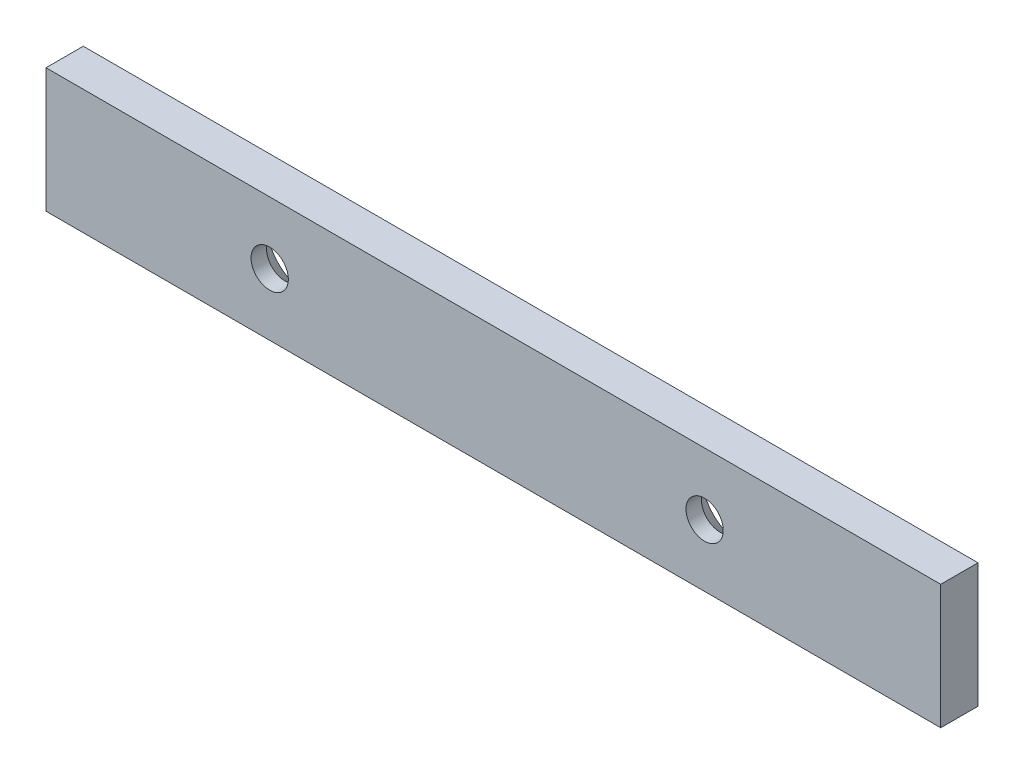
ISO-10303-21;
HEADER;
FILE_DESCRIPTION(('STEP AP214'),'2;1');
FILE_NAME('part.step','',(''),(''),'','','');
FILE_SCHEMA(('AUTOMOTIVE_DESIGN { 1 0 10303 214 1 1 1 1 }'));
ENDSEC;
DATA;
#1=APPLICATION_CONTEXT('core data for automotive mechanical design processes');
#2=APPLICATION_PROTOCOL_DEFINITION('international standard','automotive_design',2000,#1);
#3=PRODUCT_CONTEXT('',#1,'mechanical');
#4=PRODUCT('Part','Part','',(#3));
#5=PRODUCT_RELATED_PRODUCT_CATEGORY('part','',(#4));
#6=PRODUCT_DEFINITION_FORMATION('','',#4);
#7=PRODUCT_DEFINITION_CONTEXT('part definition',#1,'design');
#8=PRODUCT_DEFINITION('design','',#6,#7);
#9=PRODUCT_DEFINITION_SHAPE('','',#8);
#10=(LENGTH_UNIT() NAMED_UNIT(*) SI_UNIT(.MILLI.,.METRE.));
#11=(NAMED_UNIT(*) PLANE_ANGLE_UNIT() SI_UNIT($,.RADIAN.));
#12=(NAMED_UNIT(*) SI_UNIT($,.STERADIAN.) SOLID_ANGLE_UNIT());
#13=UNCERTAINTY_MEASURE_WITH_UNIT(LENGTH_MEASURE(1.E-05),#10,'distance_accuracy_value','');
#14=(GEOMETRIC_REPRESENTATION_CONTEXT(3) GLOBAL_UNCERTAINTY_ASSIGNED_CONTEXT((#13)) GLOBAL_UNIT_ASSIGNED_CONTEXT((#10,
#11,#12)) REPRESENTATION_CONTEXT('',''));
#15=CARTESIAN_POINT('',(0.,0.,0.));
#16=DIRECTION('',(0.,0.,1.));
#17=DIRECTION('',(1.,0.,0.));
#18=AXIS2_PLACEMENT_3D('',#15,#16,#17);
#19=CARTESIAN_POINT('',(-55.6641781740509,14.3159818061718,6.00000000000001));
#20=DIRECTION('',(1.,0.,0.));
#21=DIRECTION('',(0.,0.,-0.999999999999992));
#22=AXIS2_PLACEMENT_3D('',#19,#20,#21);
#23=PLANE('',#22);
#24=DIRECTION('',(0.,-1.,0.));
#25=VECTOR('',#24,1.);
#26=CARTESIAN_POINT('',(-55.6641781740509,14.3159818061718,0.));
#27=LINE('',#26,#25);
#28=CARTESIAN_POINT('',(-55.6641781740509,14.3159818061718,0.));
#29=VERTEX_POINT('',#28);
#30=CARTESIAN_POINT('',(-55.6641781740509,-5.68401819382819,0.));
#31=VERTEX_POINT('',#30);
#32=EDGE_CURVE('E105',#29,#31,#27,.T.);
#33=ORIENTED_EDGE('',*,*,#32,.T.);
#34=DIRECTION('',(0.,0.,-0.999999999999992));
#35=VECTOR('',#34,1.);
#36=CARTESIAN_POINT('',(-55.6641781740509,-5.68401819382819,6.00000000000001));
#37=LINE('',#36,#35);
#38=CARTESIAN_POINT('',(-55.6641781740509,-5.68401819382819,6.00000000000001));
#39=VERTEX_POINT('',#38);
#40=EDGE_CURVE('E11',#39,#31,#37,.T.);
#41=ORIENTED_EDGE('',*,*,#40,.F.);
#42=DIRECTION('',(0.,-1.,0.));
#43=VECTOR('',#42,1.);
#44=CARTESIAN_POINT('',(-55.6641781740509,14.3159818061718,6.00000000000001));
#45=LINE('',#44,#43);
#46=CARTESIAN_POINT('',(-55.6641781740509,14.3159818061718,6.00000000000001));
#47=VERTEX_POINT('',#46);
#48=EDGE_CURVE('E92',#47,#39,#45,.T.);
#49=ORIENTED_EDGE('',*,*,#48,.F.);
#50=DIRECTION('',(0.,0.,-0.999999999999992));
#51=VECTOR('',#50,1.);
#52=CARTESIAN_POINT('',(-55.6641781740509,14.3159818061718,6.00000000000001));
#53=LINE('',#52,#51);
#54=EDGE_CURVE('E101',#47,#29,#53,.T.);
#55=ORIENTED_EDGE('',*,*,#54,.T.);
#56=EDGE_LOOP('',(#33,#41,#49,#55));
#57=FACE_BOUND('',#56,.T.);
#58=ADVANCED_FACE('F39',(#57),#23,.F.);
#59=CARTESIAN_POINT('',(-55.6641781740509,-5.68401819382819,6.00000000000001));
#60=DIRECTION('',(0.,1.,0.));
#61=DIRECTION('',(0.,0.,0.999999999999992));
#62=AXIS2_PLACEMENT_3D('',#59,#60,#61);
#63=PLANE('',#62);
#64=DIRECTION('',(1.,0.,0.));
#65=VECTOR('',#64,1.);
#66=CARTESIAN_POINT('',(-55.6641781740509,-5.68401819382819,0.));
#67=LINE('',#66,#65);
#68=CARTESIAN_POINT('',(88.3358218259482,-5.68401819382916,0.));
#69=VERTEX_POINT('',#68);
#70=EDGE_CURVE('E96',#31,#69,#67,.T.);
#71=ORIENTED_EDGE('',*,*,#70,.T.);
#72=DIRECTION('',(0.,0.,-0.999999999999992));
#73=VECTOR('',#72,1.);
#74=CARTESIAN_POINT('',(88.3358218259482,-5.68401819382916,6.00000000000001));
#75=LINE('',#74,#73);
#76=CARTESIAN_POINT('',(88.3358218259482,-5.68401819382916,6.00000000000001));
#77=VERTEX_POINT('',#76);
#78=EDGE_CURVE('E48',#77,#69,#75,.T.);
#79=ORIENTED_EDGE('',*,*,#78,.F.);
#80=DIRECTION('',(1.,0.,0.));
#81=VECTOR('',#80,1.);
#82=CARTESIAN_POINT('',(-55.6641781740509,-5.68401819382819,6.00000000000001));
#83=LINE('',#82,#81);
#84=EDGE_CURVE('E87',#39,#77,#83,.T.);
#85=ORIENTED_EDGE('',*,*,#84,.F.);
#86=ORIENTED_EDGE('',*,*,#40,.T.);
#87=EDGE_LOOP('',(#71,#79,#85,#86));
#88=FACE_BOUND('',#87,.T.);
#89=ADVANCED_FACE('F95',(#88),#63,.F.);
#90=CARTESIAN_POINT('',(88.3358218259491,14.3159818061709,6.00000000000001));
#91=DIRECTION('',(-1.,0.,0.));
#92=DIRECTION('',(0.,0.,0.999999999999992));
#93=AXIS2_PLACEMENT_3D('',#90,#91,#92);
#94=PLANE('',#93);
#95=DIRECTION('',(0.,1.,0.));
#96=VECTOR('',#95,1.);
#97=CARTESIAN_POINT('',(88.3358218259491,14.3159818061709,0.));
#98=LINE('',#97,#96);
#99=CARTESIAN_POINT('',(88.3358218259491,14.3159818061709,0.));
#100=VERTEX_POINT('',#99);
#101=EDGE_CURVE('E74',#69,#100,#98,.T.);
#102=ORIENTED_EDGE('',*,*,#101,.T.);
#103=DIRECTION('',(0.,0.,-0.999999999999992));
#104=VECTOR('',#103,1.);
#105=CARTESIAN_POINT('',(88.3358218259491,14.3159818061709,6.00000000000001));
#106=LINE('',#105,#104);
#107=CARTESIAN_POINT('',(88.3358218259491,14.3159818061709,6.00000000000001));
#108=VERTEX_POINT('',#107);
#109=EDGE_CURVE('E97',#108,#100,#106,.T.);
#110=ORIENTED_EDGE('',*,*,#109,.F.);
#111=DIRECTION('',(0.,1.,0.));
#112=VECTOR('',#111,1.);
#113=CARTESIAN_POINT('',(88.3358218259491,14.3159818061709,6.00000000000001));
#114=LINE('',#113,#112);
#115=EDGE_CURVE('E90',#77,#108,#114,.T.);
#116=ORIENTED_EDGE('',*,*,#115,.F.);
#117=ORIENTED_EDGE('',*,*,#78,.T.);
#118=EDGE_LOOP('',(#102,#110,#116,#117));
#119=FACE_BOUND('',#118,.T.);
#120=ADVANCED_FACE('F99',(#119),#94,.F.);
#121=CARTESIAN_POINT('',(-55.6641781740509,14.3159818061718,6.00000000000001));
#122=DIRECTION('',(0.,-1.,0.));
#123=DIRECTION('',(0.,0.,-0.999999999999992));
#124=AXIS2_PLACEMENT_3D('',#121,#122,#123);
#125=PLANE('',#124);
#126=DIRECTION('',(-1.,0.,0.));
#127=VECTOR('',#126,1.);
#128=CARTESIAN_POINT('',(-55.6641781740509,14.3159818061718,0.));
#129=LINE('',#128,#127);
#130=EDGE_CURVE('E80',#100,#29,#129,.T.);
#131=ORIENTED_EDGE('',*,*,#130,.T.);
#132=ORIENTED_EDGE('',*,*,#54,.F.);
#133=DIRECTION('',(-1.,0.,0.));
#134=VECTOR('',#133,1.);
#135=CARTESIAN_POINT('',(-55.6641781740509,14.3159818061718,6.00000000000001));
#136=LINE('',#135,#134);
#137=EDGE_CURVE('E57',#108,#47,#136,.T.);
#138=ORIENTED_EDGE('',*,*,#137,.F.);
#139=ORIENTED_EDGE('',*,*,#109,.T.);
#140=EDGE_LOOP('',(#131,#132,#138,#139));
#141=FACE_BOUND('',#140,.T.);
#142=ADVANCED_FACE('F143',(#141),#125,.F.);
#143=CARTESIAN_POINT('',(0.,0.,6.00000000000001));
#144=DIRECTION('',(0.,0.,0.999999999999992));
#145=DIRECTION('',(1.,0.,0.));
#146=AXIS2_PLACEMENT_3D('',#143,#144,#145);
#147=PLANE('',#146);
#148=CARTESIAN_POINT('',(50.3358218259491,4.31598180617085,6.00000000000001));
#149=DIRECTION('',(0.,0.,0.999999999999992));
#150=DIRECTION('',(1.,0.,0.));
#151=AXIS2_PLACEMENT_3D('',#148,#149,#150);
#152=CIRCLE('',#151,2.99999999999999);
#153=CARTESIAN_POINT('',(47.3358218259491,4.31598180617085,6.00000000000001));
#154=VERTEX_POINT('',#153);
#155=EDGE_CURVE('E42',#154,#154,#152,.T.);
#156=ORIENTED_EDGE('',*,*,#155,.F.);
#157=EDGE_LOOP('',(#156));
#158=FACE_BOUND('',#157,.T.);
#159=CARTESIAN_POINT('',(-19.6641781740509,4.31598180617088,6.00000000000001));
#160=DIRECTION('',(0.,0.,0.999999999999992));
#161=DIRECTION('',(1.,0.,0.));
#162=AXIS2_PLACEMENT_3D('',#159,#160,#161);
#163=CIRCLE('',#162,2.99999999999999);
#164=CARTESIAN_POINT('',(-22.6641781740509,4.31598180617088,6.00000000000001));
#165=VERTEX_POINT('',#164);
#166=EDGE_CURVE('E108',#165,#165,#163,.T.);
#167=ORIENTED_EDGE('',*,*,#166,.F.);
#168=EDGE_LOOP('',(#167));
#169=FACE_BOUND('',#168,.T.);
#170=ORIENTED_EDGE('',*,*,#48,.T.);
#171=ORIENTED_EDGE('',*,*,#84,.T.);
#172=ORIENTED_EDGE('',*,*,#115,.T.);
#173=ORIENTED_EDGE('',*,*,#137,.T.);
#174=EDGE_LOOP('',(#170,#171,#172,#173));
#175=FACE_BOUND('',#174,.T.);
#176=ADVANCED_FACE('F88',(#158,#169,#175),#147,.T.);
#177=CARTESIAN_POINT('',(0.,0.,0.));
#178=DIRECTION('',(0.,0.,0.999999999999992));
#179=DIRECTION('',(1.,0.,0.));
#180=AXIS2_PLACEMENT_3D('',#177,#178,#179);
#181=PLANE('',#180);
#182=CARTESIAN_POINT('',(50.3358218259491,4.31598180617085,0.));
#183=DIRECTION('',(0.,0.,-0.999999999999992));
#184=DIRECTION('',(-1.,0.,0.));
#185=AXIS2_PLACEMENT_3D('',#182,#183,#184);
#186=CIRCLE('',#185,6.5);
#187=CARTESIAN_POINT('',(43.8358218259491,4.31598180617085,0.));
#188=VERTEX_POINT('',#187);
#189=EDGE_CURVE('E128',#188,#188,#186,.T.);
#190=ORIENTED_EDGE('',*,*,#189,.F.);
#191=EDGE_LOOP('',(#190));
#192=FACE_BOUND('',#191,.T.);
#193=CARTESIAN_POINT('',(-19.6641781740509,4.31598180617088,0.));
#194=DIRECTION('',(0.,0.,-0.999999999999992));
#195=DIRECTION('',(-1.,0.,0.));
#196=AXIS2_PLACEMENT_3D('',#193,#194,#195);
#197=CIRCLE('',#196,6.5);
#198=CARTESIAN_POINT('',(-26.1641781740509,4.31598180617088,0.));
#199=VERTEX_POINT('',#198);
#200=EDGE_CURVE('E118',#199,#199,#197,.T.);
#201=ORIENTED_EDGE('',*,*,#200,.F.);
#202=EDGE_LOOP('',(#201));
#203=FACE_BOUND('',#202,.T.);
#204=ORIENTED_EDGE('',*,*,#32,.F.);
#205=ORIENTED_EDGE('',*,*,#130,.F.);
#206=ORIENTED_EDGE('',*,*,#101,.F.);
#207=ORIENTED_EDGE('',*,*,#70,.F.);
#208=EDGE_LOOP('',(#204,#205,#206,#207));
#209=FACE_BOUND('',#208,.T.);
#210=ADVANCED_FACE('F134',(#192,#203,#209),#181,.F.);
#211=CARTESIAN_POINT('',(-19.6641781740509,4.31598180617088,0.));
#212=DIRECTION('',(0.,0.,-0.999999999999992));
#213=DIRECTION('',(-1.,0.,0.));
#214=AXIS2_PLACEMENT_3D('',#211,#212,#213);
#215=CYLINDRICAL_SURFACE('',#214,2.99999999999999);
#216=CARTESIAN_POINT('',(-19.6641781740509,4.31598180617088,3.50000000000002));
#217=DIRECTION('',(0.,0.,-0.999999999999992));
#218=DIRECTION('',(-1.,0.,0.));
#219=AXIS2_PLACEMENT_3D('',#216,#217,#218);
#220=CIRCLE('',#219,2.99999999999999);
#221=CARTESIAN_POINT('',(-22.6641781740509,4.31598180617088,3.50000000000002));
#222=VERTEX_POINT('',#221);
#223=EDGE_CURVE('E114',#222,#222,#220,.T.);
#224=CARTESIAN_POINT('',(-22.6641781740509,4.31598180617088,6.00000000000001));
#225=CARTESIAN_POINT('',(-22.6641781740509,4.31598180617088,5.97395833333334));
#226=CARTESIAN_POINT('',(-22.6641781740509,4.31598180617088,5.94791666666667));
#227=CARTESIAN_POINT('',(-22.6641781740509,4.31598180617088,5.89583333333334));
#228=CARTESIAN_POINT('',(-22.6641781740509,4.31598180617088,5.86979166666667));
#229=CARTESIAN_POINT('',(-22.6641781740509,4.31598180617088,5.81770833333334));
#230=CARTESIAN_POINT('',(-22.6641781740509,4.31598180617088,5.79166666666667));
#231=CARTESIAN_POINT('',(-22.6641781740509,4.31598180617088,5.73958333333334));
#232=CARTESIAN_POINT('',(-22.6641781740509,4.31598180617088,5.71354166666667));
#233=CARTESIAN_POINT('',(-22.6641781740509,4.31598180617088,5.66145833333334));
#234=CARTESIAN_POINT('',(-22.6641781740509,4.31598180617088,5.63541666666667));
#235=CARTESIAN_POINT('',(-22.6641781740509,4.31598180617088,5.58333333333334));
#236=CARTESIAN_POINT('',(-22.6641781740509,4.31598180617088,5.55729166666667));
#237=CARTESIAN_POINT('',(-22.6641781740509,4.31598180617088,5.50520833333334));
#238=CARTESIAN_POINT('',(-22.6641781740509,4.31598180617088,5.47916666666667));
#239=CARTESIAN_POINT('',(-22.6641781740509,4.31598180617088,5.42708333333334));
#240=CARTESIAN_POINT('',(-22.6641781740509,4.31598180617088,5.40104166666667));
#241=CARTESIAN_POINT('',(-22.6641781740509,4.31598180617088,5.34895833333334));
#242=CARTESIAN_POINT('',(-22.6641781740509,4.31598180617088,5.32291666666668));
#243=CARTESIAN_POINT('',(-22.6641781740509,4.31598180617088,5.27083333333334));
#244=CARTESIAN_POINT('',(-22.6641781740509,4.31598180617088,5.24479166666667));
#245=CARTESIAN_POINT('',(-22.6641781740509,4.31598180617088,5.19270833333334));
#246=CARTESIAN_POINT('',(-22.6641781740509,4.31598180617088,5.16666666666668));
#247=CARTESIAN_POINT('',(-22.6641781740509,4.31598180617088,5.11458333333334));
#248=CARTESIAN_POINT('',(-22.6641781740509,4.31598180617088,5.08854166666668));
#249=CARTESIAN_POINT('',(-22.6641781740509,4.31598180617088,5.03645833333334));
#250=CARTESIAN_POINT('',(-22.6641781740509,4.31598180617088,5.01041666666668));
#251=CARTESIAN_POINT('',(-22.6641781740509,4.31598180617088,4.95833333333334));
#252=CARTESIAN_POINT('',(-22.6641781740509,4.31598180617088,4.93229166666668));
#253=CARTESIAN_POINT('',(-22.6641781740509,4.31598180617088,4.88020833333334));
#254=CARTESIAN_POINT('',(-22.6641781740509,4.31598180617088,4.85416666666668));
#255=CARTESIAN_POINT('',(-22.6641781740509,4.31598180617088,4.80208333333334));
#256=CARTESIAN_POINT('',(-22.6641781740509,4.31598180617088,4.77604166666668));
#257=CARTESIAN_POINT('',(-22.6641781740509,4.31598180617088,4.72395833333334));
#258=CARTESIAN_POINT('',(-22.6641781740509,4.31598180617088,4.69791666666668));
#259=CARTESIAN_POINT('',(-22.6641781740509,4.31598180617088,4.64583333333335));
#260=CARTESIAN_POINT('',(-22.6641781740509,4.31598180617088,4.61979166666668));
#261=CARTESIAN_POINT('',(-22.6641781740509,4.31598180617088,4.56770833333335));
#262=CARTESIAN_POINT('',(-22.6641781740509,4.31598180617088,4.54166666666668));
#263=CARTESIAN_POINT('',(-22.6641781740509,4.31598180617088,4.48958333333335));
#264=CARTESIAN_POINT('',(-22.6641781740509,4.31598180617088,4.46354166666668));
#265=CARTESIAN_POINT('',(-22.6641781740509,4.31598180617088,4.41145833333335));
#266=CARTESIAN_POINT('',(-22.6641781740509,4.31598180617088,4.38541666666668));
#267=CARTESIAN_POINT('',(-22.6641781740509,4.31598180617088,4.33333333333335));
#268=CARTESIAN_POINT('',(-22.6641781740509,4.31598180617088,4.30729166666668));
#269=CARTESIAN_POINT('',(-22.6641781740509,4.31598180617088,4.25520833333335));
#270=CARTESIAN_POINT('',(-22.6641781740509,4.31598180617088,4.22916666666668));
#271=CARTESIAN_POINT('',(-22.6641781740509,4.31598180617088,4.17708333333335));
#272=CARTESIAN_POINT('',(-22.6641781740509,4.31598180617088,4.15104166666668));
#273=CARTESIAN_POINT('',(-22.6641781740509,4.31598180617088,4.09895833333335));
#274=CARTESIAN_POINT('',(-22.6641781740509,4.31598180617088,4.07291666666668));
#275=CARTESIAN_POINT('',(-22.6641781740509,4.31598180617088,4.02083333333335));
#276=CARTESIAN_POINT('',(-22.6641781740509,4.31598180617088,3.99479166666668));
#277=CARTESIAN_POINT('',(-22.6641781740509,4.31598180617088,3.94270833333335));
#278=CARTESIAN_POINT('',(-22.6641781740509,4.31598180617088,3.91666666666668));
#279=CARTESIAN_POINT('',(-22.6641781740509,4.31598180617088,3.86458333333335));
#280=CARTESIAN_POINT('',(-22.6641781740509,4.31598180617088,3.83854166666668));
#281=CARTESIAN_POINT('',(-22.6641781740509,4.31598180617088,3.78645833333335));
#282=CARTESIAN_POINT('',(-22.6641781740509,4.31598180617088,3.76041666666668));
#283=CARTESIAN_POINT('',(-22.6641781740509,4.31598180617088,3.70833333333335));
#284=CARTESIAN_POINT('',(-22.6641781740509,4.31598180617088,3.68229166666668));
#285=CARTESIAN_POINT('',(-22.6641781740509,4.31598180617088,3.63020833333335));
#286=CARTESIAN_POINT('',(-22.6641781740509,4.31598180617088,3.60416666666668));
#287=CARTESIAN_POINT('',(-22.6641781740509,4.31598180617088,3.55208333333335));
#288=CARTESIAN_POINT('',(-22.6641781740509,4.31598180617088,3.52604166666668));
#289=CARTESIAN_POINT('',(-22.6641781740509,4.31598180617088,3.50000000000002));
#290=B_SPLINE_CURVE_WITH_KNOTS('',3,(#224,#225,#226,#227,#228,#229,#230,#231,#232,#233,#234,
#235,#236,#237,#238,#239,#240,#241,#242,#243,#244,#245,#246,#247,#248,#249,#250,#251,#252,#253,
#254,#255,#256,#257,#258,#259,#260,#261,#262,#263,#264,#265,#266,#267,#268,#269,#270,#271,#272,
#273,#274,#275,#276,#277,#278,#279,#280,#281,#282,#283,#284,#285,#286,#287,#288,#289),
.UNSPECIFIED.,.F.,.F.,(4,2,2,2,2,2,2,2,2,2,2,2,2,2,2,2,2,2,2,2,2,2,2,2,2,2,2,2,2,2,2,2,4),(0.,
0.0781249999999992,0.156249999999998,0.234374999999999,0.312499999999999,0.390624999999998,
0.468749999999998,0.546874999999997,0.624999999999997,0.703124999999996,0.781249999999996,
0.859374999999996,0.937499999999995,1.01562499999999,1.09374999999999,1.17187499999999,
1.24999999999999,1.32812499999999,1.40624999999999,1.48437499999999,1.56249999999999,
1.64062499999999,1.71874999999999,1.79687499999999,1.87499999999999,1.95312499999999,
2.03124999999999,2.10937499999999,2.18749999999999,2.26562499999999,2.34374999999999,
2.42187499999999,2.49999999999999),.UNSPECIFIED.);
#291=EDGE_CURVE('BSEAM137',#165,#222,#290,.T.);
#292=ORIENTED_EDGE('',*,*,#166,.T.);
#293=ORIENTED_EDGE('',*,*,#223,.T.);
#294=ORIENTED_EDGE('',*,*,#291,.T.);
#295=ORIENTED_EDGE('',*,*,#291,.F.);
#296=EDGE_LOOP('',(#292,#294,#293,#295));
#297=FACE_BOUND('',#296,.T.);
#298=ADVANCED_FACE('F137',(#297),#215,.F.);
#299=CARTESIAN_POINT('',(-19.6641781740509,4.31598180617088,0.));
#300=DIRECTION('',(0.,0.,-0.999999999999992));
#301=DIRECTION('',(-1.,0.,0.));
#302=AXIS2_PLACEMENT_3D('',#299,#300,#301);
#303=CONICAL_SURFACE('',#302,6.5,0.785398163397447);
#304=CARTESIAN_POINT('',(-22.6641781740509,4.31598180617088,3.50000000000002));
#305=CARTESIAN_POINT('',(-22.7006365073842,4.31598180617088,3.46354166666668));
#306=CARTESIAN_POINT('',(-22.7370948407176,4.31598180617088,3.42708333333335));
#307=CARTESIAN_POINT('',(-22.8100115073842,4.31598180617088,3.35416666666668));
#308=CARTESIAN_POINT('',(-22.8464698407176,4.31598180617088,3.31770833333335));
#309=CARTESIAN_POINT('',(-22.9193865073842,4.31598180617088,3.24479166666668));
#310=CARTESIAN_POINT('',(-22.9558448407176,4.31598180617088,3.20833333333335));
#311=CARTESIAN_POINT('',(-23.0287615073842,4.31598180617088,3.13541666666668));
#312=CARTESIAN_POINT('',(-23.0652198407176,4.31598180617088,3.09895833333335));
#313=CARTESIAN_POINT('',(-23.1381365073842,4.31598180617088,3.02604166666668));
#314=CARTESIAN_POINT('',(-23.1745948407176,4.31598180617088,2.98958333333335));
#315=CARTESIAN_POINT('',(-23.2475115073842,4.31598180617088,2.91666666666668));
#316=CARTESIAN_POINT('',(-23.2839698407176,4.31598180617088,2.88020833333335));
#317=CARTESIAN_POINT('',(-23.3568865073842,4.31598180617088,2.80729166666668));
#318=CARTESIAN_POINT('',(-23.3933448407176,4.31598180617088,2.77083333333335));
#319=CARTESIAN_POINT('',(-23.4662615073842,4.31598180617088,2.69791666666668));
#320=CARTESIAN_POINT('',(-23.5027198407176,4.31598180617088,2.66145833333335));
#321=CARTESIAN_POINT('',(-23.5756365073842,4.31598180617088,2.58854166666668));
#322=CARTESIAN_POINT('',(-23.6120948407176,4.31598180617088,2.55208333333335));
#323=CARTESIAN_POINT('',(-23.6850115073843,4.31598180617088,2.47916666666668));
#324=CARTESIAN_POINT('',(-23.7214698407176,4.31598180617088,2.44270833333335));
#325=CARTESIAN_POINT('',(-23.7943865073842,4.31598180617088,2.36979166666668));
#326=CARTESIAN_POINT('',(-23.8308448407176,4.31598180617088,2.33333333333334));
#327=CARTESIAN_POINT('',(-23.9037615073843,4.31598180617088,2.26041666666668));
#328=CARTESIAN_POINT('',(-23.9402198407176,4.31598180617088,2.22395833333334));
#329=CARTESIAN_POINT('',(-24.0131365073843,4.31598180617088,2.15104166666668));
#330=CARTESIAN_POINT('',(-24.0495948407176,4.31598180617088,2.11458333333334));
#331=CARTESIAN_POINT('',(-24.1225115073843,4.31598180617088,2.04166666666668));
#332=CARTESIAN_POINT('',(-24.1589698407176,4.31598180617088,2.00520833333334));
#333=CARTESIAN_POINT('',(-24.2318865073843,4.31598180617088,1.93229166666668));
#334=CARTESIAN_POINT('',(-24.2683448407176,4.31598180617088,1.89583333333334));
#335=CARTESIAN_POINT('',(-24.3412615073843,4.31598180617088,1.82291666666668));
#336=CARTESIAN_POINT('',(-24.3777198407176,4.31598180617088,1.78645833333334));
#337=CARTESIAN_POINT('',(-24.4506365073843,4.31598180617088,1.71354166666668));
#338=CARTESIAN_POINT('',(-24.4870948407176,4.31598180617088,1.67708333333334));
#339=CARTESIAN_POINT('',(-24.5600115073843,4.31598180617088,1.60416666666667));
#340=CARTESIAN_POINT('',(-24.5964698407176,4.31598180617088,1.56770833333334));
#341=CARTESIAN_POINT('',(-24.6693865073843,4.31598180617088,1.49479166666667));
#342=CARTESIAN_POINT('',(-24.7058448407176,4.31598180617088,1.45833333333334));
#343=CARTESIAN_POINT('',(-24.7787615073843,4.31598180617088,1.38541666666667));
#344=CARTESIAN_POINT('',(-24.8152198407176,4.31598180617088,1.34895833333334));
#345=CARTESIAN_POINT('',(-24.8881365073843,4.31598180617088,1.27604166666667));
#346=CARTESIAN_POINT('',(-24.9245948407176,4.31598180617088,1.23958333333334));
#347=CARTESIAN_POINT('',(-24.9975115073843,4.31598180617088,1.16666666666667));
#348=CARTESIAN_POINT('',(-25.0339698407176,4.31598180617088,1.13020833333334));
#349=CARTESIAN_POINT('',(-25.1068865073843,4.31598180617088,1.05729166666667));
#350=CARTESIAN_POINT('',(-25.1433448407176,4.31598180617088,1.02083333333334));
#351=CARTESIAN_POINT('',(-25.2162615073843,4.31598180617088,0.947916666666671));
#352=CARTESIAN_POINT('',(-25.2527198407176,4.31598180617088,0.911458333333338));
#353=CARTESIAN_POINT('',(-25.3256365073843,4.31598180617088,0.838541666666671));
#354=CARTESIAN_POINT('',(-25.3620948407176,4.31598180617088,0.802083333333337));
#355=CARTESIAN_POINT('',(-25.4350115073843,4.31598180617088,0.72916666666667));
#356=CARTESIAN_POINT('',(-25.4714698407176,4.31598180617088,0.692708333333337));
#357=CARTESIAN_POINT('',(-25.5443865073843,4.31598180617088,0.61979166666667));
#358=CARTESIAN_POINT('',(-25.5808448407176,4.31598180617088,0.583333333333337));
#359=CARTESIAN_POINT('',(-25.6537615073843,4.31598180617088,0.510416666666669));
#360=CARTESIAN_POINT('',(-25.6902198407176,4.31598180617088,0.473958333333335));
#361=CARTESIAN_POINT('',(-25.7631365073843,4.31598180617088,0.401041666666668));
#362=CARTESIAN_POINT('',(-25.7995948407176,4.31598180617088,0.364583333333335));
#363=CARTESIAN_POINT('',(-25.8725115073843,4.31598180617088,0.291666666666668));
#364=CARTESIAN_POINT('',(-25.9089698407176,4.31598180617088,0.255208333333335));
#365=CARTESIAN_POINT('',(-25.9818865073843,4.31598180617088,0.182291666666668));
#366=CARTESIAN_POINT('',(-26.0183448407176,4.31598180617088,0.145833333333334));
#367=CARTESIAN_POINT('',(-26.0912615073843,4.31598180617088,0.0729166666666675));
#368=CARTESIAN_POINT('',(-26.1277198407176,4.31598180617088,0.0364583333333342));
#369=CARTESIAN_POINT('',(-26.1641781740509,4.31598180617088,0.));
#370=B_SPLINE_CURVE_WITH_KNOTS('',3,(#304,#305,#306,#307,#308,#309,#310,#311,#312,#313,#314,
#315,#316,#317,#318,#319,#320,#321,#322,#323,#324,#325,#326,#327,#328,#329,#330,#331,#332,#333,
#334,#335,#336,#337,#338,#339,#340,#341,#342,#343,#344,#345,#346,#347,#348,#349,#350,#351,#352,
#353,#354,#355,#356,#357,#358,#359,#360,#361,#362,#363,#364,#365,#366,#367,#368,#369),
.UNSPECIFIED.,.F.,.F.,(4,2,2,2,2,2,2,2,2,2,2,2,2,2,2,2,2,2,2,2,2,2,2,2,2,2,2,2,2,2,2,2,4),(0.,
0.154679608384559,0.309359216769118,0.464038825153677,0.618718433538236,0.773398041922795,
0.928077650307351,1.08275725869191,1.23743686707647,1.39211647546103,1.54679608384558,
1.70147569223014,1.8561553006147,2.01083490899926,2.16551451738382,2.32019412576838,
2.47487373415294,2.62955334253749,2.78423295092205,2.93891255930661,3.09359216769117,
3.24827177607573,3.40295138446029,3.55763099284485,3.7123106012294,3.86699020961396,
4.02166981799852,4.17634942638308,4.33102903476764,4.4857086431522,4.64038825153676,
4.79506785992132,4.94974746830587),.UNSPECIFIED.);
#371=EDGE_CURVE('BSEAM188',#222,#199,#370,.T.);
#372=ORIENTED_EDGE('',*,*,#223,.F.);
#373=ORIENTED_EDGE('',*,*,#200,.T.);
#374=ORIENTED_EDGE('',*,*,#371,.T.);
#375=ORIENTED_EDGE('',*,*,#371,.F.);
#376=EDGE_LOOP('',(#372,#374,#373,#375));
#377=FACE_BOUND('',#376,.T.);
#378=ADVANCED_FACE('F188',(#377),#303,.F.);
#379=CARTESIAN_POINT('',(50.3358218259491,4.31598180617085,0.));
#380=DIRECTION('',(0.,0.,-0.999999999999992));
#381=DIRECTION('',(-1.,0.,0.));
#382=AXIS2_PLACEMENT_3D('',#379,#380,#381);
#383=CYLINDRICAL_SURFACE('',#382,2.99999999999999);
#384=CARTESIAN_POINT('',(50.3358218259491,4.31598180617085,3.50000000000002));
#385=DIRECTION('',(0.,0.,-0.999999999999992));
#386=DIRECTION('',(-1.,0.,0.));
#387=AXIS2_PLACEMENT_3D('',#384,#385,#386);
#388=CIRCLE('',#387,2.99999999999999);
#389=CARTESIAN_POINT('',(47.3358218259491,4.31598180617085,3.50000000000002));
#390=VERTEX_POINT('',#389);
#391=EDGE_CURVE('E125',#390,#390,#388,.T.);
#392=CARTESIAN_POINT('',(47.3358218259491,4.31598180617085,6.00000000000001));
#393=CARTESIAN_POINT('',(47.3358218259491,4.31598180617085,5.97395833333334));
#394=CARTESIAN_POINT('',(47.3358218259491,4.31598180617085,5.94791666666667));
#395=CARTESIAN_POINT('',(47.3358218259491,4.31598180617085,5.89583333333334));
#396=CARTESIAN_POINT('',(47.3358218259491,4.31598180617085,5.86979166666667));
#397=CARTESIAN_POINT('',(47.3358218259491,4.31598180617085,5.81770833333334));
#398=CARTESIAN_POINT('',(47.3358218259491,4.31598180617085,5.79166666666667));
#399=CARTESIAN_POINT('',(47.3358218259491,4.31598180617085,5.73958333333334));
#400=CARTESIAN_POINT('',(47.3358218259491,4.31598180617085,5.71354166666667));
#401=CARTESIAN_POINT('',(47.3358218259491,4.31598180617085,5.66145833333334));
#402=CARTESIAN_POINT('',(47.3358218259491,4.31598180617085,5.63541666666667));
#403=CARTESIAN_POINT('',(47.3358218259491,4.31598180617085,5.58333333333334));
#404=CARTESIAN_POINT('',(47.3358218259491,4.31598180617085,5.55729166666667));
#405=CARTESIAN_POINT('',(47.3358218259491,4.31598180617085,5.50520833333334));
#406=CARTESIAN_POINT('',(47.3358218259491,4.31598180617085,5.47916666666667));
#407=CARTESIAN_POINT('',(47.3358218259491,4.31598180617085,5.42708333333334));
#408=CARTESIAN_POINT('',(47.3358218259491,4.31598180617085,5.40104166666667));
#409=CARTESIAN_POINT('',(47.3358218259491,4.31598180617085,5.34895833333334));
#410=CARTESIAN_POINT('',(47.3358218259491,4.31598180617085,5.32291666666668));
#411=CARTESIAN_POINT('',(47.3358218259491,4.31598180617085,5.27083333333334));
#412=CARTESIAN_POINT('',(47.3358218259491,4.31598180617085,5.24479166666667));
#413=CARTESIAN_POINT('',(47.3358218259491,4.31598180617085,5.19270833333334));
#414=CARTESIAN_POINT('',(47.3358218259491,4.31598180617085,5.16666666666668));
#415=CARTESIAN_POINT('',(47.3358218259491,4.31598180617085,5.11458333333334));
#416=CARTESIAN_POINT('',(47.3358218259491,4.31598180617085,5.08854166666668));
#417=CARTESIAN_POINT('',(47.3358218259491,4.31598180617085,5.03645833333334));
#418=CARTESIAN_POINT('',(47.3358218259491,4.31598180617085,5.01041666666668));
#419=CARTESIAN_POINT('',(47.3358218259491,4.31598180617085,4.95833333333334));
#420=CARTESIAN_POINT('',(47.3358218259491,4.31598180617085,4.93229166666668));
#421=CARTESIAN_POINT('',(47.3358218259491,4.31598180617085,4.88020833333334));
#422=CARTESIAN_POINT('',(47.3358218259491,4.31598180617085,4.85416666666668));
#423=CARTESIAN_POINT('',(47.3358218259491,4.31598180617085,4.80208333333334));
#424=CARTESIAN_POINT('',(47.3358218259491,4.31598180617085,4.77604166666668));
#425=CARTESIAN_POINT('',(47.3358218259491,4.31598180617085,4.72395833333334));
#426=CARTESIAN_POINT('',(47.3358218259491,4.31598180617085,4.69791666666668));
#427=CARTESIAN_POINT('',(47.3358218259491,4.31598180617085,4.64583333333335));
#428=CARTESIAN_POINT('',(47.3358218259491,4.31598180617085,4.61979166666668));
#429=CARTESIAN_POINT('',(47.3358218259491,4.31598180617085,4.56770833333335));
#430=CARTESIAN_POINT('',(47.3358218259491,4.31598180617085,4.54166666666668));
#431=CARTESIAN_POINT('',(47.3358218259491,4.31598180617085,4.48958333333335));
#432=CARTESIAN_POINT('',(47.3358218259491,4.31598180617085,4.46354166666668));
#433=CARTESIAN_POINT('',(47.3358218259491,4.31598180617085,4.41145833333335));
#434=CARTESIAN_POINT('',(47.3358218259491,4.31598180617085,4.38541666666668));
#435=CARTESIAN_POINT('',(47.3358218259491,4.31598180617085,4.33333333333335));
#436=CARTESIAN_POINT('',(47.3358218259491,4.31598180617085,4.30729166666668));
#437=CARTESIAN_POINT('',(47.3358218259491,4.31598180617085,4.25520833333335));
#438=CARTESIAN_POINT('',(47.3358218259491,4.31598180617085,4.22916666666668));
#439=CARTESIAN_POINT('',(47.3358218259491,4.31598180617085,4.17708333333335));
#440=CARTESIAN_POINT('',(47.3358218259491,4.31598180617085,4.15104166666668));
#441=CARTESIAN_POINT('',(47.3358218259491,4.31598180617085,4.09895833333335));
#442=CARTESIAN_POINT('',(47.3358218259491,4.31598180617085,4.07291666666668));
#443=CARTESIAN_POINT('',(47.3358218259491,4.31598180617085,4.02083333333335));
#444=CARTESIAN_POINT('',(47.3358218259491,4.31598180617085,3.99479166666668));
#445=CARTESIAN_POINT('',(47.3358218259491,4.31598180617085,3.94270833333335));
#446=CARTESIAN_POINT('',(47.3358218259491,4.31598180617085,3.91666666666668));
#447=CARTESIAN_POINT('',(47.3358218259491,4.31598180617085,3.86458333333335));
#448=CARTESIAN_POINT('',(47.3358218259491,4.31598180617085,3.83854166666668));
#449=CARTESIAN_POINT('',(47.3358218259491,4.31598180617085,3.78645833333335));
#450=CARTESIAN_POINT('',(47.3358218259491,4.31598180617085,3.76041666666668));
#451=CARTESIAN_POINT('',(47.3358218259491,4.31598180617085,3.70833333333335));
#452=CARTESIAN_POINT('',(47.3358218259491,4.31598180617085,3.68229166666668));
#453=CARTESIAN_POINT('',(47.3358218259491,4.31598180617085,3.63020833333335));
#454=CARTESIAN_POINT('',(47.3358218259491,4.31598180617085,3.60416666666668));
#455=CARTESIAN_POINT('',(47.3358218259491,4.31598180617085,3.55208333333335));
#456=CARTESIAN_POINT('',(47.3358218259491,4.31598180617085,3.52604166666668));
#457=CARTESIAN_POINT('',(47.3358218259491,4.31598180617085,3.50000000000002));
#458=B_SPLINE_CURVE_WITH_KNOTS('',3,(#392,#393,#394,#395,#396,#397,#398,#399,#400,#401,#402,
#403,#404,#405,#406,#407,#408,#409,#410,#411,#412,#413,#414,#415,#416,#417,#418,#419,#420,#421,
#422,#423,#424,#425,#426,#427,#428,#429,#430,#431,#432,#433,#434,#435,#436,#437,#438,#439,#440,
#441,#442,#443,#444,#445,#446,#447,#448,#449,#450,#451,#452,#453,#454,#455,#456,#457),
.UNSPECIFIED.,.F.,.F.,(4,2,2,2,2,2,2,2,2,2,2,2,2,2,2,2,2,2,2,2,2,2,2,2,2,2,2,2,2,2,2,2,4),(0.,
0.0781249999999992,0.156249999999998,0.234374999999999,0.312499999999999,0.390624999999998,
0.468749999999998,0.546874999999997,0.624999999999997,0.703124999999996,0.781249999999996,
0.859374999999996,0.937499999999995,1.01562499999999,1.09374999999999,1.17187499999999,
1.24999999999999,1.32812499999999,1.40624999999999,1.48437499999999,1.56249999999999,
1.64062499999999,1.71874999999999,1.79687499999999,1.87499999999999,1.95312499999999,
2.03124999999999,2.10937499999999,2.18749999999999,2.26562499999999,2.34374999999999,
2.42187499999999,2.49999999999999),.UNSPECIFIED.);
#459=EDGE_CURVE('BSEAM197',#154,#390,#458,.T.);
#460=ORIENTED_EDGE('',*,*,#155,.T.);
#461=ORIENTED_EDGE('',*,*,#391,.T.);
#462=ORIENTED_EDGE('',*,*,#459,.T.);
#463=ORIENTED_EDGE('',*,*,#459,.F.);
#464=EDGE_LOOP('',(#460,#462,#461,#463));
#465=FACE_BOUND('',#464,.T.);
#466=ADVANCED_FACE('F197',(#465),#383,.F.);
#467=CARTESIAN_POINT('',(50.3358218259491,4.31598180617085,0.));
#468=DIRECTION('',(0.,0.,-0.999999999999992));
#469=DIRECTION('',(-1.,0.,0.));
#470=AXIS2_PLACEMENT_3D('',#467,#468,#469);
#471=CONICAL_SURFACE('',#470,6.5,0.785398163397447);
#472=CARTESIAN_POINT('',(47.3358218259491,4.31598180617085,3.50000000000002));
#473=CARTESIAN_POINT('',(47.2993634926158,4.31598180617085,3.46354166666668));
#474=CARTESIAN_POINT('',(47.2629051592824,4.31598180617085,3.42708333333335));
#475=CARTESIAN_POINT('',(47.1899884926158,4.31598180617085,3.35416666666668));
#476=CARTESIAN_POINT('',(47.1535301592824,4.31598180617085,3.31770833333335));
#477=CARTESIAN_POINT('',(47.0806134926158,4.31598180617085,3.24479166666668));
#478=CARTESIAN_POINT('',(47.0441551592824,4.31598180617085,3.20833333333335));
#479=CARTESIAN_POINT('',(46.9712384926158,4.31598180617085,3.13541666666668));
#480=CARTESIAN_POINT('',(46.9347801592824,4.31598180617085,3.09895833333335));
#481=CARTESIAN_POINT('',(46.8618634926158,4.31598180617085,3.02604166666668));
#482=CARTESIAN_POINT('',(46.8254051592824,4.31598180617085,2.98958333333335));
#483=CARTESIAN_POINT('',(46.7524884926158,4.31598180617085,2.91666666666668));
#484=CARTESIAN_POINT('',(46.7160301592824,4.31598180617085,2.88020833333335));
#485=CARTESIAN_POINT('',(46.6431134926158,4.31598180617085,2.80729166666668));
#486=CARTESIAN_POINT('',(46.6066551592824,4.31598180617085,2.77083333333335));
#487=CARTESIAN_POINT('',(46.5337384926158,4.31598180617085,2.69791666666668));
#488=CARTESIAN_POINT('',(46.4972801592824,4.31598180617085,2.66145833333335));
#489=CARTESIAN_POINT('',(46.4243634926158,4.31598180617085,2.58854166666668));
#490=CARTESIAN_POINT('',(46.3879051592824,4.31598180617085,2.55208333333335));
#491=CARTESIAN_POINT('',(46.3149884926158,4.31598180617085,2.47916666666668));
#492=CARTESIAN_POINT('',(46.2785301592824,4.31598180617085,2.44270833333335));
#493=CARTESIAN_POINT('',(46.2056134926158,4.31598180617085,2.36979166666668));
#494=CARTESIAN_POINT('',(46.1691551592824,4.31598180617085,2.33333333333335));
#495=CARTESIAN_POINT('',(46.0962384926158,4.31598180617085,2.26041666666668));
#496=CARTESIAN_POINT('',(46.0597801592824,4.31598180617085,2.22395833333334));
#497=CARTESIAN_POINT('',(45.9868634926158,4.31598180617085,2.15104166666668));
#498=CARTESIAN_POINT('',(45.9504051592824,4.31598180617085,2.11458333333334));
#499=CARTESIAN_POINT('',(45.8774884926158,4.31598180617085,2.04166666666668));
#500=CARTESIAN_POINT('',(45.8410301592824,4.31598180617085,2.00520833333334));
#501=CARTESIAN_POINT('',(45.7681134926158,4.31598180617085,1.93229166666668));
#502=CARTESIAN_POINT('',(45.7316551592824,4.31598180617085,1.89583333333334));
#503=CARTESIAN_POINT('',(45.6587384926158,4.31598180617085,1.82291666666668));
#504=CARTESIAN_POINT('',(45.6222801592824,4.31598180617085,1.78645833333334));
#505=CARTESIAN_POINT('',(45.5493634926158,4.31598180617085,1.71354166666668));
#506=CARTESIAN_POINT('',(45.5129051592824,4.31598180617085,1.67708333333334));
#507=CARTESIAN_POINT('',(45.4399884926158,4.31598180617085,1.60416666666667));
#508=CARTESIAN_POINT('',(45.4035301592824,4.31598180617085,1.56770833333334));
#509=CARTESIAN_POINT('',(45.3306134926158,4.31598180617085,1.49479166666667));
#510=CARTESIAN_POINT('',(45.2941551592824,4.31598180617085,1.45833333333334));
#511=CARTESIAN_POINT('',(45.2212384926158,4.31598180617085,1.38541666666667));
#512=CARTESIAN_POINT('',(45.1847801592824,4.31598180617085,1.34895833333334));
#513=CARTESIAN_POINT('',(45.1118634926157,4.31598180617085,1.27604166666667));
#514=CARTESIAN_POINT('',(45.0754051592824,4.31598180617085,1.23958333333334));
#515=CARTESIAN_POINT('',(45.0024884926157,4.31598180617085,1.16666666666667));
#516=CARTESIAN_POINT('',(44.9660301592824,4.31598180617085,1.13020833333334));
#517=CARTESIAN_POINT('',(44.8931134926157,4.31598180617085,1.05729166666667));
#518=CARTESIAN_POINT('',(44.8566551592824,4.31598180617085,1.02083333333334));
#519=CARTESIAN_POINT('',(44.7837384926157,4.31598180617085,0.947916666666671));
#520=CARTESIAN_POINT('',(44.7472801592824,4.31598180617085,0.911458333333338));
#521=CARTESIAN_POINT('',(44.6743634926157,4.31598180617085,0.838541666666671));
#522=CARTESIAN_POINT('',(44.6379051592824,4.31598180617085,0.802083333333337));
#523=CARTESIAN_POINT('',(44.5649884926157,4.31598180617085,0.72916666666667));
#524=CARTESIAN_POINT('',(44.5285301592824,4.31598180617085,0.692708333333337));
#525=CARTESIAN_POINT('',(44.4556134926157,4.31598180617085,0.61979166666667));
#526=CARTESIAN_POINT('',(44.4191551592824,4.31598180617085,0.583333333333337));
#527=CARTESIAN_POINT('',(44.3462384926157,4.31598180617085,0.51041666666667));
#528=CARTESIAN_POINT('',(44.3097801592824,4.31598180617085,0.473958333333335));
#529=CARTESIAN_POINT('',(44.2368634926157,4.31598180617085,0.401041666666668));
#530=CARTESIAN_POINT('',(44.2004051592824,4.31598180617085,0.364583333333335));
#531=CARTESIAN_POINT('',(44.1274884926157,4.31598180617085,0.291666666666668));
#532=CARTESIAN_POINT('',(44.0910301592824,4.31598180617085,0.255208333333335));
#533=CARTESIAN_POINT('',(44.0181134926157,4.31598180617085,0.182291666666667));
#534=CARTESIAN_POINT('',(43.9816551592824,4.31598180617085,0.145833333333334));
#535=CARTESIAN_POINT('',(43.9087384926157,4.31598180617085,0.0729166666666671));
#536=CARTESIAN_POINT('',(43.8722801592824,4.31598180617085,0.0364583333333335));
#537=CARTESIAN_POINT('',(43.8358218259491,4.31598180617085,0.));
#538=B_SPLINE_CURVE_WITH_KNOTS('',3,(#472,#473,#474,#475,#476,#477,#478,#479,#480,#481,#482,
#483,#484,#485,#486,#487,#488,#489,#490,#491,#492,#493,#494,#495,#496,#497,#498,#499,#500,#501,
#502,#503,#504,#505,#506,#507,#508,#509,#510,#511,#512,#513,#514,#515,#516,#517,#518,#519,#520,
#521,#522,#523,#524,#525,#526,#527,#528,#529,#530,#531,#532,#533,#534,#535,#536,#537),
.UNSPECIFIED.,.F.,.F.,(4,2,2,2,2,2,2,2,2,2,2,2,2,2,2,2,2,2,2,2,2,2,2,2,2,2,2,2,2,2,2,2,4),(0.,
0.154679608384559,0.309359216769118,0.464038825153677,0.618718433538236,0.773398041922795,
0.928077650307354,1.08275725869191,1.23743686707647,1.39211647546103,1.54679608384558,
1.70147569223014,1.8561553006147,2.01083490899926,2.16551451738382,2.32019412576838,
2.47487373415294,2.62955334253749,2.78423295092205,2.93891255930661,3.09359216769117,
3.24827177607573,3.40295138446029,3.55763099284485,3.7123106012294,3.86699020961396,
4.02166981799852,4.17634942638308,4.33102903476764,4.4857086431522,4.64038825153675,
4.79506785992131,4.94974746830587),.UNSPECIFIED.);
#539=EDGE_CURVE('BSEAM132',#390,#188,#538,.T.);
#540=ORIENTED_EDGE('',*,*,#391,.F.);
#541=ORIENTED_EDGE('',*,*,#189,.T.);
#542=ORIENTED_EDGE('',*,*,#539,.T.);
#543=ORIENTED_EDGE('',*,*,#539,.F.);
#544=EDGE_LOOP('',(#540,#542,#541,#543));
#545=FACE_BOUND('',#544,.T.);
#546=ADVANCED_FACE('F132',(#545),#471,.F.);
#547=CLOSED_SHELL('',(#58,#89,#120,#142,#176,#210,#298,#378,#466,#546));
#548=MANIFOLD_SOLID_BREP('B2',#547);
#549=ADVANCED_BREP_SHAPE_REPRESENTATION('',(#18,#548),#14);
#550=SHAPE_DEFINITION_REPRESENTATION(#9,#549);
ENDSEC;
END-ISO-10303-21;
